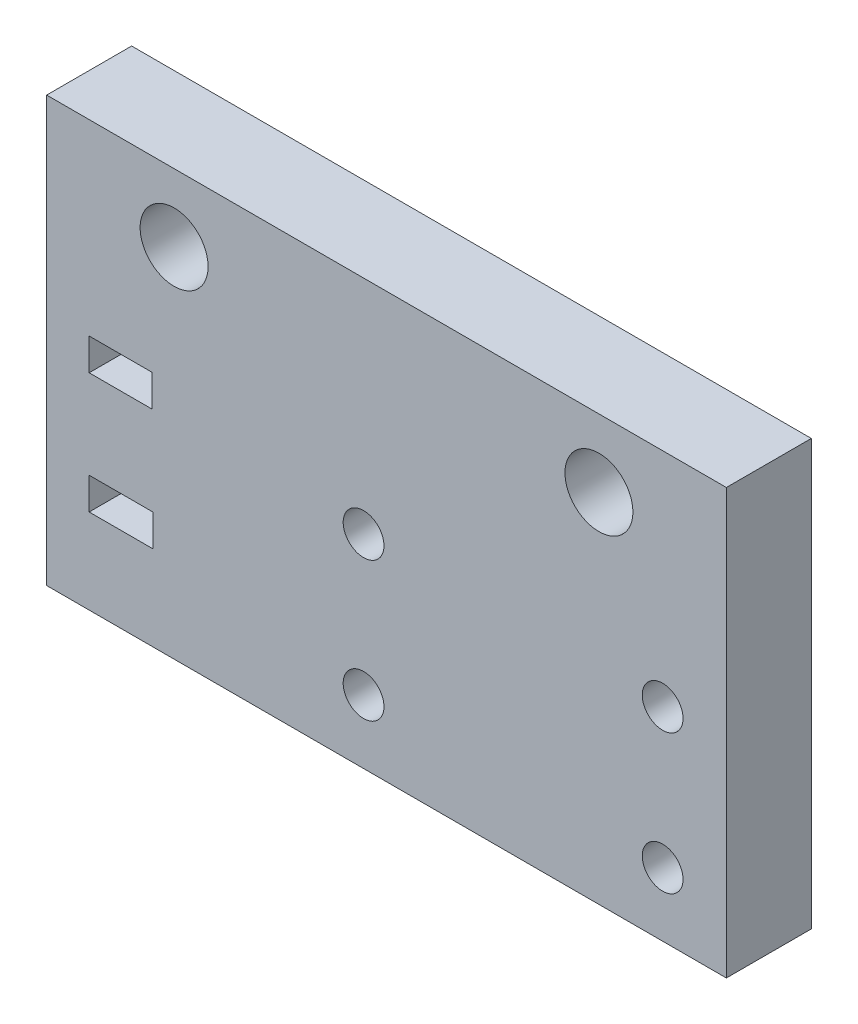
ISO-10303-21;
HEADER;
FILE_DESCRIPTION(('STEP AP214'),'2;1');
FILE_NAME('part.step','',(''),(''),'','','');
FILE_SCHEMA(('AUTOMOTIVE_DESIGN { 1 0 10303 214 1 1 1 1 }'));
ENDSEC;
DATA;
#1=APPLICATION_CONTEXT('core data for automotive mechanical design processes');
#2=APPLICATION_PROTOCOL_DEFINITION('international standard','automotive_design',2000,#1);
#3=PRODUCT_CONTEXT('',#1,'mechanical');
#4=PRODUCT('Part','Part','',(#3));
#5=PRODUCT_RELATED_PRODUCT_CATEGORY('part','',(#4));
#6=PRODUCT_DEFINITION_FORMATION('','',#4);
#7=PRODUCT_DEFINITION_CONTEXT('part definition',#1,'design');
#8=PRODUCT_DEFINITION('design','',#6,#7);
#9=PRODUCT_DEFINITION_SHAPE('','',#8);
#10=(LENGTH_UNIT() NAMED_UNIT(*) SI_UNIT(.MILLI.,.METRE.));
#11=(NAMED_UNIT(*) PLANE_ANGLE_UNIT() SI_UNIT($,.RADIAN.));
#12=(NAMED_UNIT(*) SI_UNIT($,.STERADIAN.) SOLID_ANGLE_UNIT());
#13=UNCERTAINTY_MEASURE_WITH_UNIT(LENGTH_MEASURE(1.E-05),#10,'distance_accuracy_value','');
#14=(GEOMETRIC_REPRESENTATION_CONTEXT(3) GLOBAL_UNCERTAINTY_ASSIGNED_CONTEXT((#13)) GLOBAL_UNIT_ASSIGNED_CONTEXT((#10,
#11,#12)) REPRESENTATION_CONTEXT('',''));
#15=CARTESIAN_POINT('',(0.,0.,0.));
#16=DIRECTION('',(0.,0.,1.));
#17=DIRECTION('',(1.,0.,0.));
#18=AXIS2_PLACEMENT_3D('',#15,#16,#17);
#19=CARTESIAN_POINT('',(-57.8460728243543,15.6982717881369,6.35));
#20=DIRECTION('',(1.,0.,0.));
#21=DIRECTION('',(0.,1.,0.));
#22=AXIS2_PLACEMENT_3D('',#19,#20,#21);
#23=PLANE('',#22);
#24=DIRECTION('',(0.,-1.,0.));
#25=VECTOR('',#24,1.);
#26=CARTESIAN_POINT('',(-57.8460728243543,15.6982717881369,6.35));
#27=LINE('',#26,#25);
#28=CARTESIAN_POINT('',(-57.8460728243543,-9.70172821186314,6.35));
#29=VERTEX_POINT('',#28);
#30=CARTESIAN_POINT('',(-57.8460728243543,-41.4517282118631,6.35));
#31=VERTEX_POINT('',#30);
#32=EDGE_CURVE('E135',#29,#31,#27,.T.);
#33=ORIENTED_EDGE('',*,*,#32,.F.);
#34=DIRECTION('',(0.,0.,1.));
#35=VECTOR('',#34,1.);
#36=CARTESIAN_POINT('',(-57.8460728243543,-9.70172821186314,0.));
#37=LINE('',#36,#35);
#38=CARTESIAN_POINT('',(-57.8460728243543,-9.70172821186314,0.));
#39=VERTEX_POINT('',#38);
#40=EDGE_CURVE('E122',#39,#29,#37,.T.);
#41=ORIENTED_EDGE('',*,*,#40,.F.);
#42=DIRECTION('',(0.,-1.,0.));
#43=VECTOR('',#42,1.);
#44=CARTESIAN_POINT('',(-57.8460728243543,15.6982717881369,0.));
#45=LINE('',#44,#43);
#46=CARTESIAN_POINT('',(-57.8460728243543,-41.4517282118631,0.));
#47=VERTEX_POINT('',#46);
#48=EDGE_CURVE('E133',#39,#47,#45,.T.);
#49=ORIENTED_EDGE('',*,*,#48,.T.);
#50=DIRECTION('',(0.,0.,-1.));
#51=VECTOR('',#50,1.);
#52=CARTESIAN_POINT('',(-57.8460728243543,-41.4517282118631,6.35));
#53=LINE('',#52,#51);
#54=EDGE_CURVE('E11',#31,#47,#53,.T.);
#55=ORIENTED_EDGE('',*,*,#54,.F.);
#56=EDGE_LOOP('',(#33,#41,#49,#55));
#57=FACE_BOUND('',#56,.T.);
#58=ADVANCED_FACE('F34',(#57),#23,.F.);
#59=CARTESIAN_POINT('',(-57.8460728243543,-41.4517282118631,6.35));
#60=DIRECTION('',(0.,1.,0.));
#61=DIRECTION('',(0.,0.,1.));
#62=AXIS2_PLACEMENT_3D('',#59,#60,#61);
#63=PLANE('',#62);
#64=DIRECTION('',(1.,0.,0.));
#65=VECTOR('',#64,1.);
#66=CARTESIAN_POINT('',(-57.8460728243543,-41.4517282118631,0.));
#67=LINE('',#66,#65);
#68=CARTESIAN_POINT('',(-7.04607282435432,-41.4517282118631,0.));
#69=VERTEX_POINT('',#68);
#70=EDGE_CURVE('E138',#47,#69,#67,.T.);
#71=ORIENTED_EDGE('',*,*,#70,.T.);
#72=DIRECTION('',(0.,0.,-1.));
#73=VECTOR('',#72,1.);
#74=CARTESIAN_POINT('',(-7.04607282435432,-41.4517282118631,6.35));
#75=LINE('',#74,#73);
#76=CARTESIAN_POINT('',(-7.04607282435432,-41.4517282118631,6.35));
#77=VERTEX_POINT('',#76);
#78=EDGE_CURVE('E41',#77,#69,#75,.T.);
#79=ORIENTED_EDGE('',*,*,#78,.F.);
#80=DIRECTION('',(1.,0.,0.));
#81=VECTOR('',#80,1.);
#82=CARTESIAN_POINT('',(-57.8460728243543,-41.4517282118631,6.35));
#83=LINE('',#82,#81);
#84=EDGE_CURVE('E155',#31,#77,#83,.T.);
#85=ORIENTED_EDGE('',*,*,#84,.F.);
#86=ORIENTED_EDGE('',*,*,#54,.T.);
#87=EDGE_LOOP('',(#71,#79,#85,#86));
#88=FACE_BOUND('',#87,.T.);
#89=ADVANCED_FACE('F258',(#88),#63,.F.);
#90=CARTESIAN_POINT('',(-7.04607282435433,15.6982717881369,6.35));
#91=DIRECTION('',(-1.,0.,0.));
#92=DIRECTION('',(0.,-1.,0.));
#93=AXIS2_PLACEMENT_3D('',#90,#91,#92);
#94=PLANE('',#93);
#95=DIRECTION('',(0.,1.,0.));
#96=VECTOR('',#95,1.);
#97=CARTESIAN_POINT('',(-7.04607282435433,15.6982717881369,0.));
#98=LINE('',#97,#96);
#99=CARTESIAN_POINT('',(-7.04607282435432,-9.70172821186313,0.));
#100=VERTEX_POINT('',#99);
#101=EDGE_CURVE('E141',#69,#100,#98,.T.);
#102=ORIENTED_EDGE('',*,*,#101,.T.);
#103=DIRECTION('',(0.,0.,1.));
#104=VECTOR('',#103,1.);
#105=CARTESIAN_POINT('',(-7.04607282435432,-9.70172821186313,0.));
#106=LINE('',#105,#104);
#107=CARTESIAN_POINT('',(-7.04607282435432,-9.70172821186313,6.35));
#108=VERTEX_POINT('',#107);
#109=EDGE_CURVE('E48',#100,#108,#106,.T.);
#110=ORIENTED_EDGE('',*,*,#109,.T.);
#111=DIRECTION('',(0.,1.,0.));
#112=VECTOR('',#111,1.);
#113=CARTESIAN_POINT('',(-7.04607282435433,15.6982717881369,6.35));
#114=LINE('',#113,#112);
#115=EDGE_CURVE('E147',#77,#108,#114,.T.);
#116=ORIENTED_EDGE('',*,*,#115,.F.);
#117=ORIENTED_EDGE('',*,*,#78,.T.);
#118=EDGE_LOOP('',(#102,#110,#116,#117));
#119=FACE_BOUND('',#118,.T.);
#120=ADVANCED_FACE('F255',(#119),#94,.F.);
#121=CARTESIAN_POINT('',(0.,0.,6.35));
#122=DIRECTION('',(0.,0.,1.));
#123=DIRECTION('',(1.,0.,0.));
#124=AXIS2_PLACEMENT_3D('',#121,#122,#123);
#125=PLANE('',#124);
#126=DIRECTION('',(1.,0.,0.));
#127=VECTOR('',#126,1.);
#128=CARTESIAN_POINT('',(-7.04607282435432,-9.70172821186313,6.35));
#129=LINE('',#128,#127);
#130=EDGE_CURVE('E128',#29,#108,#129,.T.);
#131=ORIENTED_EDGE('',*,*,#130,.F.);
#132=ORIENTED_EDGE('',*,*,#32,.T.);
#133=ORIENTED_EDGE('',*,*,#84,.T.);
#134=ORIENTED_EDGE('',*,*,#115,.T.);
#135=EDGE_LOOP('',(#131,#132,#133,#134));
#136=FACE_BOUND('',#135,.T.);
#137=DIRECTION('',(0.,-1.,0.));
#138=VECTOR('',#137,1.);
#139=CARTESIAN_POINT('',(-54.6710728243543,-32.7204782118631,6.35));
#140=LINE('',#139,#138);
#141=CARTESIAN_POINT('',(-54.6710728243543,-32.7204782118631,6.35));
#142=VERTEX_POINT('',#141);
#143=CARTESIAN_POINT('',(-54.6710728243543,-35.1017282118631,6.35));
#144=VERTEX_POINT('',#143);
#145=EDGE_CURVE('E56',#142,#144,#140,.T.);
#146=ORIENTED_EDGE('',*,*,#145,.F.);
#147=DIRECTION('',(-1.,0.,0.));
#148=VECTOR('',#147,1.);
#149=CARTESIAN_POINT('',(-54.6710728243543,-32.7204782118631,6.35));
#150=LINE('',#149,#148);
#151=CARTESIAN_POINT('',(-49.9085728243543,-32.7204782118631,6.35));
#152=VERTEX_POINT('',#151);
#153=EDGE_CURVE('E233',#152,#142,#150,.T.);
#154=ORIENTED_EDGE('',*,*,#153,.F.);
#155=DIRECTION('',(0.,1.,0.));
#156=VECTOR('',#155,1.);
#157=CARTESIAN_POINT('',(-49.9085728243543,-32.7204782118631,6.35));
#158=LINE('',#157,#156);
#159=CARTESIAN_POINT('',(-49.9085728243543,-35.1017282118631,6.35));
#160=VERTEX_POINT('',#159);
#161=EDGE_CURVE('E237',#160,#152,#158,.T.);
#162=ORIENTED_EDGE('',*,*,#161,.F.);
#163=DIRECTION('',(1.,0.,0.));
#164=VECTOR('',#163,1.);
#165=CARTESIAN_POINT('',(-54.6710728243543,-35.1017282118631,6.35));
#166=LINE('',#165,#164);
#167=EDGE_CURVE('E240',#144,#160,#166,.T.);
#168=ORIENTED_EDGE('',*,*,#167,.F.);
#169=EDGE_LOOP('',(#146,#154,#162,#168));
#170=FACE_BOUND('',#169,.T.);
#171=DIRECTION('',(0.,-1.,0.));
#172=VECTOR('',#171,1.);
#173=CARTESIAN_POINT('',(-54.6710728243543,-23.7095589867169,6.35));
#174=LINE('',#173,#172);
#175=CARTESIAN_POINT('',(-54.6710728243543,-23.7095589867169,6.35));
#176=VERTEX_POINT('',#175);
#177=CARTESIAN_POINT('',(-54.6710728243543,-26.0908089867169,6.35));
#178=VERTEX_POINT('',#177);
#179=EDGE_CURVE('E213',#176,#178,#174,.T.);
#180=ORIENTED_EDGE('',*,*,#179,.F.);
#181=DIRECTION('',(-1.,0.,0.));
#182=VECTOR('',#181,1.);
#183=CARTESIAN_POINT('',(-54.6710728243543,-23.7095589867169,6.35));
#184=LINE('',#183,#182);
#185=CARTESIAN_POINT('',(-49.9701493731482,-23.7095589867169,6.35));
#186=VERTEX_POINT('',#185);
#187=EDGE_CURVE('E203',#186,#176,#184,.T.);
#188=ORIENTED_EDGE('',*,*,#187,.F.);
#189=DIRECTION('',(0.,1.,0.));
#190=VECTOR('',#189,1.);
#191=CARTESIAN_POINT('',(-49.9701493731482,-23.7095589867169,6.35));
#192=LINE('',#191,#190);
#193=CARTESIAN_POINT('',(-49.9701493731482,-26.0908089867169,6.35));
#194=VERTEX_POINT('',#193);
#195=EDGE_CURVE('E207',#194,#186,#192,.T.);
#196=ORIENTED_EDGE('',*,*,#195,.F.);
#197=DIRECTION('',(1.,0.,0.));
#198=VECTOR('',#197,1.);
#199=CARTESIAN_POINT('',(-54.6710728243543,-26.0908089867169,6.35));
#200=LINE('',#199,#198);
#201=EDGE_CURVE('E210',#178,#194,#200,.T.);
#202=ORIENTED_EDGE('',*,*,#201,.F.);
#203=EDGE_LOOP('',(#180,#188,#196,#202));
#204=FACE_BOUND('',#203,.T.);
#205=CARTESIAN_POINT('',(-48.3210728243541,-14.7817282118631,6.35));
#206=DIRECTION('',(0.,0.,1.));
#207=DIRECTION('',(1.,0.,0.));
#208=AXIS2_PLACEMENT_3D('',#205,#206,#207);
#209=CIRCLE('',#208,2.54);
#210=CARTESIAN_POINT('',(-45.7810728243541,-14.7817282118631,6.35));
#211=VERTEX_POINT('',#210);
#212=EDGE_CURVE('E181',#211,#211,#209,.T.);
#213=ORIENTED_EDGE('',*,*,#212,.F.);
#214=EDGE_LOOP('',(#213));
#215=FACE_BOUND('',#214,.T.);
#216=CARTESIAN_POINT('',(-11.8085728243543,-36.6892282118631,6.35));
#217=DIRECTION('',(0.,0.,1.));
#218=DIRECTION('',(1.,0.,0.));
#219=AXIS2_PLACEMENT_3D('',#216,#217,#218);
#220=CIRCLE('',#219,1.524);
#221=CARTESIAN_POINT('',(-10.2845728243543,-36.6892282118631,6.35));
#222=VERTEX_POINT('',#221);
#223=EDGE_CURVE('E170',#222,#222,#220,.T.);
#224=ORIENTED_EDGE('',*,*,#223,.F.);
#225=EDGE_LOOP('',(#224));
#226=FACE_BOUND('',#225,.T.);
#227=CARTESIAN_POINT('',(-34.1605728243543,-26.2752282118631,6.35));
#228=DIRECTION('',(0.,0.,1.));
#229=DIRECTION('',(1.,0.,0.));
#230=AXIS2_PLACEMENT_3D('',#227,#228,#229);
#231=CIRCLE('',#230,1.52400000000001);
#232=CARTESIAN_POINT('',(-32.6365728243543,-26.2752282118631,6.35));
#233=VERTEX_POINT('',#232);
#234=EDGE_CURVE('E163',#233,#233,#231,.T.);
#235=ORIENTED_EDGE('',*,*,#234,.F.);
#236=EDGE_LOOP('',(#235));
#237=FACE_BOUND('',#236,.T.);
#238=CARTESIAN_POINT('',(-34.1605728243543,-36.6892282118631,6.35));
#239=DIRECTION('',(0.,0.,1.));
#240=DIRECTION('',(1.,0.,0.));
#241=AXIS2_PLACEMENT_3D('',#238,#239,#240);
#242=CIRCLE('',#241,1.52400000000001);
#243=CARTESIAN_POINT('',(-32.6365728243543,-36.6892282118631,6.35));
#244=VERTEX_POINT('',#243);
#245=EDGE_CURVE('E175',#244,#244,#242,.T.);
#246=ORIENTED_EDGE('',*,*,#245,.F.);
#247=EDGE_LOOP('',(#246));
#248=FACE_BOUND('',#247,.T.);
#249=CARTESIAN_POINT('',(-16.5710728243541,-14.7817282118631,6.35));
#250=DIRECTION('',(0.,0.,1.));
#251=DIRECTION('',(1.,0.,0.));
#252=AXIS2_PLACEMENT_3D('',#249,#250,#251);
#253=CIRCLE('',#252,2.54);
#254=CARTESIAN_POINT('',(-14.0310728243541,-14.7817282118631,6.35));
#255=VERTEX_POINT('',#254);
#256=EDGE_CURVE('E187',#255,#255,#253,.T.);
#257=ORIENTED_EDGE('',*,*,#256,.F.);
#258=EDGE_LOOP('',(#257));
#259=FACE_BOUND('',#258,.T.);
#260=CARTESIAN_POINT('',(-11.8085728243543,-26.2752282118631,6.35));
#261=DIRECTION('',(0.,0.,1.));
#262=DIRECTION('',(1.,0.,0.));
#263=AXIS2_PLACEMENT_3D('',#260,#261,#262);
#264=CIRCLE('',#263,1.524);
#265=CARTESIAN_POINT('',(-10.2845728243543,-26.2752282118631,6.35));
#266=VERTEX_POINT('',#265);
#267=EDGE_CURVE('E144',#266,#266,#264,.T.);
#268=ORIENTED_EDGE('',*,*,#267,.F.);
#269=EDGE_LOOP('',(#268));
#270=FACE_BOUND('',#269,.T.);
#271=ADVANCED_FACE('F257',(#136,#170,#204,#215,#226,#237,#248,#259,#270),#125,.T.);
#272=CARTESIAN_POINT('',(0.,0.,0.));
#273=DIRECTION('',(0.,0.,1.));
#274=DIRECTION('',(1.,0.,0.));
#275=AXIS2_PLACEMENT_3D('',#272,#273,#274);
#276=PLANE('',#275);
#277=DIRECTION('',(-1.,0.,0.));
#278=VECTOR('',#277,1.);
#279=CARTESIAN_POINT('',(-54.6710728243543,-32.7204782118631,0.));
#280=LINE('',#279,#278);
#281=CARTESIAN_POINT('',(-49.9085728243543,-32.7204782118631,0.));
#282=VERTEX_POINT('',#281);
#283=CARTESIAN_POINT('',(-54.6710728243543,-32.7204782118631,0.));
#284=VERTEX_POINT('',#283);
#285=EDGE_CURVE('E228',#282,#284,#280,.T.);
#286=ORIENTED_EDGE('',*,*,#285,.T.);
#287=DIRECTION('',(0.,-1.,0.));
#288=VECTOR('',#287,1.);
#289=CARTESIAN_POINT('',(-54.6710728243543,-32.7204782118631,0.));
#290=LINE('',#289,#288);
#291=CARTESIAN_POINT('',(-54.6710728243543,-35.1017282118631,0.));
#292=VERTEX_POINT('',#291);
#293=EDGE_CURVE('E236',#284,#292,#290,.T.);
#294=ORIENTED_EDGE('',*,*,#293,.T.);
#295=DIRECTION('',(1.,0.,0.));
#296=VECTOR('',#295,1.);
#297=CARTESIAN_POINT('',(-54.6710728243543,-35.1017282118631,0.));
#298=LINE('',#297,#296);
#299=CARTESIAN_POINT('',(-49.9085728243543,-35.1017282118631,0.));
#300=VERTEX_POINT('',#299);
#301=EDGE_CURVE('E249',#292,#300,#298,.T.);
#302=ORIENTED_EDGE('',*,*,#301,.T.);
#303=DIRECTION('',(0.,1.,0.));
#304=VECTOR('',#303,1.);
#305=CARTESIAN_POINT('',(-49.9085728243543,-32.7204782118631,0.));
#306=LINE('',#305,#304);
#307=EDGE_CURVE('E246',#300,#282,#306,.T.);
#308=ORIENTED_EDGE('',*,*,#307,.T.);
#309=EDGE_LOOP('',(#286,#294,#302,#308));
#310=FACE_BOUND('',#309,.T.);
#311=DIRECTION('',(-1.,0.,0.));
#312=VECTOR('',#311,1.);
#313=CARTESIAN_POINT('',(-54.6710728243543,-23.7095589867169,0.));
#314=LINE('',#313,#312);
#315=CARTESIAN_POINT('',(-49.9701493731482,-23.7095589867169,0.));
#316=VERTEX_POINT('',#315);
#317=CARTESIAN_POINT('',(-54.6710728243543,-23.7095589867169,0.));
#318=VERTEX_POINT('',#317);
#319=EDGE_CURVE('E197',#316,#318,#314,.T.);
#320=ORIENTED_EDGE('',*,*,#319,.T.);
#321=DIRECTION('',(0.,-1.,0.));
#322=VECTOR('',#321,1.);
#323=CARTESIAN_POINT('',(-54.6710728243543,-23.7095589867169,0.));
#324=LINE('',#323,#322);
#325=CARTESIAN_POINT('',(-54.6710728243543,-26.0908089867169,0.));
#326=VERTEX_POINT('',#325);
#327=EDGE_CURVE('E206',#318,#326,#324,.T.);
#328=ORIENTED_EDGE('',*,*,#327,.T.);
#329=DIRECTION('',(1.,0.,0.));
#330=VECTOR('',#329,1.);
#331=CARTESIAN_POINT('',(-54.6710728243543,-26.0908089867169,0.));
#332=LINE('',#331,#330);
#333=CARTESIAN_POINT('',(-49.9701493731482,-26.0908089867169,0.));
#334=VERTEX_POINT('',#333);
#335=EDGE_CURVE('E220',#326,#334,#332,.T.);
#336=ORIENTED_EDGE('',*,*,#335,.T.);
#337=DIRECTION('',(0.,1.,0.));
#338=VECTOR('',#337,1.);
#339=CARTESIAN_POINT('',(-49.9701493731482,-23.7095589867169,0.));
#340=LINE('',#339,#338);
#341=EDGE_CURVE('E217',#334,#316,#340,.T.);
#342=ORIENTED_EDGE('',*,*,#341,.T.);
#343=EDGE_LOOP('',(#320,#328,#336,#342));
#344=FACE_BOUND('',#343,.T.);
#345=CARTESIAN_POINT('',(-48.3210728243541,-14.7817282118631,0.));
#346=DIRECTION('',(0.,0.,1.));
#347=DIRECTION('',(1.,0.,0.));
#348=AXIS2_PLACEMENT_3D('',#345,#346,#347);
#349=CIRCLE('',#348,2.54);
#350=CARTESIAN_POINT('',(-45.7810728243541,-14.7817282118631,0.));
#351=VERTEX_POINT('',#350);
#352=EDGE_CURVE('E178',#351,#351,#349,.T.);
#353=ORIENTED_EDGE('',*,*,#352,.T.);
#354=EDGE_LOOP('',(#353));
#355=FACE_BOUND('',#354,.T.);
#356=CARTESIAN_POINT('',(-11.8085728243543,-36.6892282118631,0.));
#357=DIRECTION('',(0.,0.,1.));
#358=DIRECTION('',(1.,0.,0.));
#359=AXIS2_PLACEMENT_3D('',#356,#357,#358);
#360=CIRCLE('',#359,1.524);
#361=CARTESIAN_POINT('',(-10.2845728243543,-36.6892282118631,0.));
#362=VERTEX_POINT('',#361);
#363=EDGE_CURVE('E161',#362,#362,#360,.T.);
#364=ORIENTED_EDGE('',*,*,#363,.T.);
#365=EDGE_LOOP('',(#364));
#366=FACE_BOUND('',#365,.T.);
#367=CARTESIAN_POINT('',(-34.1605728243543,-26.2752282118631,0.));
#368=DIRECTION('',(0.,0.,1.));
#369=DIRECTION('',(1.,0.,0.));
#370=AXIS2_PLACEMENT_3D('',#367,#368,#369);
#371=CIRCLE('',#370,1.52400000000001);
#372=CARTESIAN_POINT('',(-32.6365728243543,-26.2752282118631,0.));
#373=VERTEX_POINT('',#372);
#374=EDGE_CURVE('E166',#373,#373,#371,.T.);
#375=ORIENTED_EDGE('',*,*,#374,.T.);
#376=EDGE_LOOP('',(#375));
#377=FACE_BOUND('',#376,.T.);
#378=CARTESIAN_POINT('',(-34.1605728243543,-36.6892282118631,0.));
#379=DIRECTION('',(0.,0.,1.));
#380=DIRECTION('',(1.,0.,0.));
#381=AXIS2_PLACEMENT_3D('',#378,#379,#380);
#382=CIRCLE('',#381,1.52400000000001);
#383=CARTESIAN_POINT('',(-32.6365728243543,-36.6892282118631,0.));
#384=VERTEX_POINT('',#383);
#385=EDGE_CURVE('E167',#384,#384,#382,.T.);
#386=ORIENTED_EDGE('',*,*,#385,.T.);
#387=EDGE_LOOP('',(#386));
#388=FACE_BOUND('',#387,.T.);
#389=CARTESIAN_POINT('',(-16.5710728243541,-14.7817282118631,0.));
#390=DIRECTION('',(0.,0.,1.));
#391=DIRECTION('',(1.,0.,0.));
#392=AXIS2_PLACEMENT_3D('',#389,#390,#391);
#393=CIRCLE('',#392,2.54);
#394=CARTESIAN_POINT('',(-14.0310728243541,-14.7817282118631,0.));
#395=VERTEX_POINT('',#394);
#396=EDGE_CURVE('E184',#395,#395,#393,.T.);
#397=ORIENTED_EDGE('',*,*,#396,.T.);
#398=EDGE_LOOP('',(#397));
#399=FACE_BOUND('',#398,.T.);
#400=CARTESIAN_POINT('',(-11.8085728243543,-26.2752282118631,0.));
#401=DIRECTION('',(0.,0.,1.));
#402=DIRECTION('',(1.,0.,0.));
#403=AXIS2_PLACEMENT_3D('',#400,#401,#402);
#404=CIRCLE('',#403,1.524);
#405=CARTESIAN_POINT('',(-10.2845728243543,-26.2752282118631,0.));
#406=VERTEX_POINT('',#405);
#407=EDGE_CURVE('E139',#406,#406,#404,.T.);
#408=ORIENTED_EDGE('',*,*,#407,.T.);
#409=EDGE_LOOP('',(#408));
#410=FACE_BOUND('',#409,.T.);
#411=ORIENTED_EDGE('',*,*,#48,.F.);
#412=DIRECTION('',(1.,0.,0.));
#413=VECTOR('',#412,1.);
#414=CARTESIAN_POINT('',(-7.04607282435432,-9.70172821186313,0.));
#415=LINE('',#414,#413);
#416=EDGE_CURVE('E119',#39,#100,#415,.T.);
#417=ORIENTED_EDGE('',*,*,#416,.T.);
#418=ORIENTED_EDGE('',*,*,#101,.F.);
#419=ORIENTED_EDGE('',*,*,#70,.F.);
#420=EDGE_LOOP('',(#411,#417,#418,#419));
#421=FACE_BOUND('',#420,.T.);
#422=ADVANCED_FACE('F137',(#310,#344,#355,#366,#377,#388,#399,#410,#421),#276,.F.);
#423=CARTESIAN_POINT('',(-11.8085728243543,-26.2752282118631,0.));
#424=DIRECTION('',(0.,0.,1.));
#425=DIRECTION('',(1.,0.,0.));
#426=AXIS2_PLACEMENT_3D('',#423,#424,#425);
#427=CYLINDRICAL_SURFACE('',#426,1.524);
#428=ORIENTED_EDGE('',*,*,#407,.F.);
#429=EDGE_LOOP('',(#428));
#430=FACE_BOUND('',#429,.T.);
#431=ORIENTED_EDGE('',*,*,#267,.T.);
#432=EDGE_LOOP('',(#431));
#433=FACE_BOUND('',#432,.T.);
#434=ADVANCED_FACE('F399',(#430,#433),#427,.F.);
#435=CARTESIAN_POINT('',(-16.5710728243541,-14.7817282118631,0.));
#436=DIRECTION('',(0.,0.,1.));
#437=DIRECTION('',(1.,0.,0.));
#438=AXIS2_PLACEMENT_3D('',#435,#436,#437);
#439=CYLINDRICAL_SURFACE('',#438,2.54);
#440=ORIENTED_EDGE('',*,*,#396,.F.);
#441=EDGE_LOOP('',(#440));
#442=FACE_BOUND('',#441,.T.);
#443=ORIENTED_EDGE('',*,*,#256,.T.);
#444=EDGE_LOOP('',(#443));
#445=FACE_BOUND('',#444,.T.);
#446=ADVANCED_FACE('F389',(#442,#445),#439,.F.);
#447=CARTESIAN_POINT('',(-34.1605728243543,-36.6892282118631,0.));
#448=DIRECTION('',(0.,0.,1.));
#449=DIRECTION('',(1.,0.,0.));
#450=AXIS2_PLACEMENT_3D('',#447,#448,#449);
#451=CYLINDRICAL_SURFACE('',#450,1.52400000000001);
#452=ORIENTED_EDGE('',*,*,#385,.F.);
#453=EDGE_LOOP('',(#452));
#454=FACE_BOUND('',#453,.T.);
#455=ORIENTED_EDGE('',*,*,#245,.T.);
#456=EDGE_LOOP('',(#455));
#457=FACE_BOUND('',#456,.T.);
#458=ADVANCED_FACE('F379',(#454,#457),#451,.F.);
#459=CARTESIAN_POINT('',(-34.1605728243543,-26.2752282118631,0.));
#460=DIRECTION('',(0.,0.,1.));
#461=DIRECTION('',(1.,0.,0.));
#462=AXIS2_PLACEMENT_3D('',#459,#460,#461);
#463=CYLINDRICAL_SURFACE('',#462,1.52400000000001);
#464=ORIENTED_EDGE('',*,*,#374,.F.);
#465=EDGE_LOOP('',(#464));
#466=FACE_BOUND('',#465,.T.);
#467=ORIENTED_EDGE('',*,*,#234,.T.);
#468=EDGE_LOOP('',(#467));
#469=FACE_BOUND('',#468,.T.);
#470=ADVANCED_FACE('F369',(#466,#469),#463,.F.);
#471=CARTESIAN_POINT('',(-11.8085728243543,-36.6892282118631,0.));
#472=DIRECTION('',(0.,0.,1.));
#473=DIRECTION('',(1.,0.,0.));
#474=AXIS2_PLACEMENT_3D('',#471,#472,#473);
#475=CYLINDRICAL_SURFACE('',#474,1.524);
#476=ORIENTED_EDGE('',*,*,#363,.F.);
#477=EDGE_LOOP('',(#476));
#478=FACE_BOUND('',#477,.T.);
#479=ORIENTED_EDGE('',*,*,#223,.T.);
#480=EDGE_LOOP('',(#479));
#481=FACE_BOUND('',#480,.T.);
#482=ADVANCED_FACE('F359',(#478,#481),#475,.F.);
#483=CARTESIAN_POINT('',(-48.3210728243541,-14.7817282118631,0.));
#484=DIRECTION('',(0.,0.,1.));
#485=DIRECTION('',(1.,0.,0.));
#486=AXIS2_PLACEMENT_3D('',#483,#484,#485);
#487=CYLINDRICAL_SURFACE('',#486,2.54);
#488=ORIENTED_EDGE('',*,*,#352,.F.);
#489=EDGE_LOOP('',(#488));
#490=FACE_BOUND('',#489,.T.);
#491=ORIENTED_EDGE('',*,*,#212,.T.);
#492=EDGE_LOOP('',(#491));
#493=FACE_BOUND('',#492,.T.);
#494=ADVANCED_FACE('F349',(#490,#493),#487,.F.);
#495=CARTESIAN_POINT('',(-54.6710728243543,-23.7095589867169,0.));
#496=DIRECTION('',(-1.,0.,0.));
#497=DIRECTION('',(0.,0.,1.));
#498=AXIS2_PLACEMENT_3D('',#495,#496,#497);
#499=PLANE('',#498);
#500=ORIENTED_EDGE('',*,*,#179,.T.);
#501=DIRECTION('',(0.,0.,1.));
#502=VECTOR('',#501,1.);
#503=CARTESIAN_POINT('',(-54.6710728243543,-26.0908089867169,0.));
#504=LINE('',#503,#502);
#505=EDGE_CURVE('E193',#326,#178,#504,.T.);
#506=ORIENTED_EDGE('',*,*,#505,.F.);
#507=ORIENTED_EDGE('',*,*,#327,.F.);
#508=DIRECTION('',(0.,0.,1.));
#509=VECTOR('',#508,1.);
#510=CARTESIAN_POINT('',(-54.6710728243543,-23.7095589867169,0.));
#511=LINE('',#510,#509);
#512=EDGE_CURVE('E201',#318,#176,#511,.T.);
#513=ORIENTED_EDGE('',*,*,#512,.T.);
#514=EDGE_LOOP('',(#500,#506,#507,#513));
#515=FACE_BOUND('',#514,.T.);
#516=ADVANCED_FACE('F339',(#515),#499,.F.);
#517=CARTESIAN_POINT('',(-54.6710728243543,-23.7095589867169,0.));
#518=DIRECTION('',(0.,1.,0.));
#519=DIRECTION('',(0.,0.,1.));
#520=AXIS2_PLACEMENT_3D('',#517,#518,#519);
#521=PLANE('',#520);
#522=ORIENTED_EDGE('',*,*,#187,.T.);
#523=ORIENTED_EDGE('',*,*,#512,.F.);
#524=ORIENTED_EDGE('',*,*,#319,.F.);
#525=DIRECTION('',(0.,0.,1.));
#526=VECTOR('',#525,1.);
#527=CARTESIAN_POINT('',(-49.9701493731482,-23.7095589867169,0.));
#528=LINE('',#527,#526);
#529=EDGE_CURVE('E199',#316,#186,#528,.T.);
#530=ORIENTED_EDGE('',*,*,#529,.T.);
#531=EDGE_LOOP('',(#522,#523,#524,#530));
#532=FACE_BOUND('',#531,.T.);
#533=ADVANCED_FACE('F329',(#532),#521,.F.);
#534=CARTESIAN_POINT('',(-49.9701493731482,-23.7095589867169,0.));
#535=DIRECTION('',(1.,0.,0.));
#536=DIRECTION('',(0.,0.,-1.));
#537=AXIS2_PLACEMENT_3D('',#534,#535,#536);
#538=PLANE('',#537);
#539=ORIENTED_EDGE('',*,*,#195,.T.);
#540=ORIENTED_EDGE('',*,*,#529,.F.);
#541=ORIENTED_EDGE('',*,*,#341,.F.);
#542=DIRECTION('',(0.,0.,1.));
#543=VECTOR('',#542,1.);
#544=CARTESIAN_POINT('',(-49.9701493731482,-26.0908089867169,0.));
#545=LINE('',#544,#543);
#546=EDGE_CURVE('E196',#334,#194,#545,.T.);
#547=ORIENTED_EDGE('',*,*,#546,.T.);
#548=EDGE_LOOP('',(#539,#540,#541,#547));
#549=FACE_BOUND('',#548,.T.);
#550=ADVANCED_FACE('F319',(#549),#538,.F.);
#551=CARTESIAN_POINT('',(-54.6710728243543,-26.0908089867169,0.));
#552=DIRECTION('',(0.,-1.,0.));
#553=DIRECTION('',(0.,0.,-1.));
#554=AXIS2_PLACEMENT_3D('',#551,#552,#553);
#555=PLANE('',#554);
#556=ORIENTED_EDGE('',*,*,#201,.T.);
#557=ORIENTED_EDGE('',*,*,#546,.F.);
#558=ORIENTED_EDGE('',*,*,#335,.F.);
#559=ORIENTED_EDGE('',*,*,#505,.T.);
#560=EDGE_LOOP('',(#556,#557,#558,#559));
#561=FACE_BOUND('',#560,.T.);
#562=ADVANCED_FACE('F310',(#561),#555,.F.);
#563=CARTESIAN_POINT('',(-54.6710728243543,-32.7204782118631,0.));
#564=DIRECTION('',(-1.,0.,0.));
#565=DIRECTION('',(0.,0.,1.));
#566=AXIS2_PLACEMENT_3D('',#563,#564,#565);
#567=PLANE('',#566);
#568=ORIENTED_EDGE('',*,*,#145,.T.);
#569=DIRECTION('',(0.,0.,1.));
#570=VECTOR('',#569,1.);
#571=CARTESIAN_POINT('',(-54.6710728243543,-35.1017282118631,0.));
#572=LINE('',#571,#570);
#573=EDGE_CURVE('E225',#292,#144,#572,.T.);
#574=ORIENTED_EDGE('',*,*,#573,.F.);
#575=ORIENTED_EDGE('',*,*,#293,.F.);
#576=DIRECTION('',(0.,0.,1.));
#577=VECTOR('',#576,1.);
#578=CARTESIAN_POINT('',(-54.6710728243543,-32.7204782118631,0.));
#579=LINE('',#578,#577);
#580=EDGE_CURVE('E190',#284,#142,#579,.T.);
#581=ORIENTED_EDGE('',*,*,#580,.T.);
#582=EDGE_LOOP('',(#568,#574,#575,#581));
#583=FACE_BOUND('',#582,.T.);
#584=ADVANCED_FACE('F300',(#583),#567,.F.);
#585=CARTESIAN_POINT('',(-54.6710728243543,-32.7204782118631,0.));
#586=DIRECTION('',(0.,1.,0.));
#587=DIRECTION('',(0.,0.,1.));
#588=AXIS2_PLACEMENT_3D('',#585,#586,#587);
#589=PLANE('',#588);
#590=ORIENTED_EDGE('',*,*,#153,.T.);
#591=ORIENTED_EDGE('',*,*,#580,.F.);
#592=ORIENTED_EDGE('',*,*,#285,.F.);
#593=DIRECTION('',(0.,0.,1.));
#594=VECTOR('',#593,1.);
#595=CARTESIAN_POINT('',(-49.9085728243543,-32.7204782118631,0.));
#596=LINE('',#595,#594);
#597=EDGE_CURVE('E230',#282,#152,#596,.T.);
#598=ORIENTED_EDGE('',*,*,#597,.T.);
#599=EDGE_LOOP('',(#590,#591,#592,#598));
#600=FACE_BOUND('',#599,.T.);
#601=ADVANCED_FACE('F290',(#600),#589,.F.);
#602=CARTESIAN_POINT('',(-49.9085728243543,-32.7204782118631,0.));
#603=DIRECTION('',(1.,0.,0.));
#604=DIRECTION('',(0.,0.,-1.));
#605=AXIS2_PLACEMENT_3D('',#602,#603,#604);
#606=PLANE('',#605);
#607=ORIENTED_EDGE('',*,*,#161,.T.);
#608=ORIENTED_EDGE('',*,*,#597,.F.);
#609=ORIENTED_EDGE('',*,*,#307,.F.);
#610=DIRECTION('',(0.,0.,1.));
#611=VECTOR('',#610,1.);
#612=CARTESIAN_POINT('',(-49.9085728243543,-35.1017282118631,0.));
#613=LINE('',#612,#611);
#614=EDGE_CURVE('E227',#300,#160,#613,.T.);
#615=ORIENTED_EDGE('',*,*,#614,.T.);
#616=EDGE_LOOP('',(#607,#608,#609,#615));
#617=FACE_BOUND('',#616,.T.);
#618=ADVANCED_FACE('F278',(#617),#606,.F.);
#619=CARTESIAN_POINT('',(-54.6710728243543,-35.1017282118631,0.));
#620=DIRECTION('',(0.,-1.,0.));
#621=DIRECTION('',(0.,0.,-1.));
#622=AXIS2_PLACEMENT_3D('',#619,#620,#621);
#623=PLANE('',#622);
#624=ORIENTED_EDGE('',*,*,#167,.T.);
#625=ORIENTED_EDGE('',*,*,#614,.F.);
#626=ORIENTED_EDGE('',*,*,#301,.F.);
#627=ORIENTED_EDGE('',*,*,#573,.T.);
#628=EDGE_LOOP('',(#624,#625,#626,#627));
#629=FACE_BOUND('',#628,.T.);
#630=ADVANCED_FACE('F273',(#629),#623,.F.);
#631=CARTESIAN_POINT('',(-7.04607282435432,-9.70172821186313,0.));
#632=DIRECTION('',(0.,-1.,0.));
#633=DIRECTION('',(1.,0.,0.));
#634=AXIS2_PLACEMENT_3D('',#631,#632,#633);
#635=PLANE('',#634);
#636=ORIENTED_EDGE('',*,*,#130,.T.);
#637=ORIENTED_EDGE('',*,*,#109,.F.);
#638=ORIENTED_EDGE('',*,*,#416,.F.);
#639=ORIENTED_EDGE('',*,*,#40,.T.);
#640=EDGE_LOOP('',(#636,#637,#638,#639));
#641=FACE_BOUND('',#640,.T.);
#642=ADVANCED_FACE('F121',(#641),#635,.F.);
#643=CLOSED_SHELL('',(#58,#89,#120,#271,#422,#434,#446,#458,#470,#482,#494,#516,#533,#550,#562,
#584,#601,#618,#630,#642));
#644=MANIFOLD_SOLID_BREP('B2',#643);
#645=ADVANCED_BREP_SHAPE_REPRESENTATION('',(#18,#644),#14);
#646=SHAPE_DEFINITION_REPRESENTATION(#9,#645);
ENDSEC;
END-ISO-10303-21;
